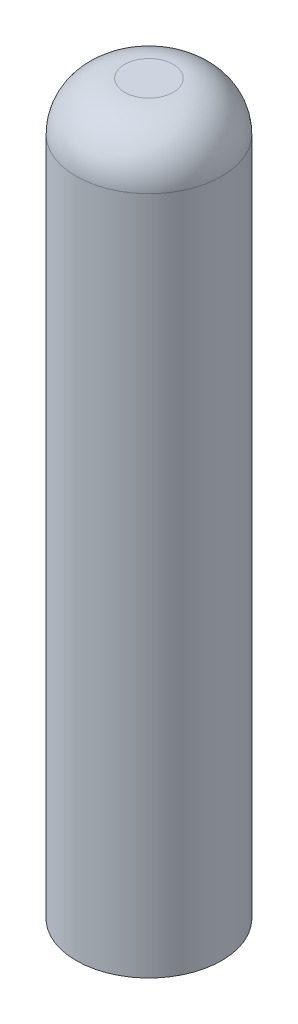
ISO-10303-21;
HEADER;
FILE_DESCRIPTION(('STEP AP214'),'2;1');
FILE_NAME('part.step','',(''),(''),'','','');
FILE_SCHEMA(('AUTOMOTIVE_DESIGN { 1 0 10303 214 1 1 1 1 }'));
ENDSEC;
DATA;
#1=APPLICATION_CONTEXT('core data for automotive mechanical design processes');
#2=APPLICATION_PROTOCOL_DEFINITION('international standard','automotive_design',2000,#1);
#3=PRODUCT_CONTEXT('',#1,'mechanical');
#4=PRODUCT('Part','Part','',(#3));
#5=PRODUCT_RELATED_PRODUCT_CATEGORY('part','',(#4));
#6=PRODUCT_DEFINITION_FORMATION('','',#4);
#7=PRODUCT_DEFINITION_CONTEXT('part definition',#1,'design');
#8=PRODUCT_DEFINITION('design','',#6,#7);
#9=PRODUCT_DEFINITION_SHAPE('','',#8);
#10=(LENGTH_UNIT() NAMED_UNIT(*) SI_UNIT(.MILLI.,.METRE.));
#11=(NAMED_UNIT(*) PLANE_ANGLE_UNIT() SI_UNIT($,.RADIAN.));
#12=(NAMED_UNIT(*) SI_UNIT($,.STERADIAN.) SOLID_ANGLE_UNIT());
#13=UNCERTAINTY_MEASURE_WITH_UNIT(LENGTH_MEASURE(1.E-05),#10,'distance_accuracy_value','');
#14=(GEOMETRIC_REPRESENTATION_CONTEXT(3) GLOBAL_UNCERTAINTY_ASSIGNED_CONTEXT((#13)) GLOBAL_UNIT_ASSIGNED_CONTEXT((#10,
#11,#12)) REPRESENTATION_CONTEXT('',''));
#15=CARTESIAN_POINT('',(0.,0.,0.));
#16=DIRECTION('',(0.,0.,1.));
#17=DIRECTION('',(1.,0.,0.));
#18=AXIS2_PLACEMENT_3D('',#15,#16,#17);
#19=CARTESIAN_POINT('',(0.,15.,0.));
#20=DIRECTION('',(0.,-1.,0.));
#21=DIRECTION('',(0.,0.,-1.));
#22=AXIS2_PLACEMENT_3D('',#19,#20,#21);
#23=CYLINDRICAL_SURFACE('',#22,1.5);
#24=CARTESIAN_POINT('',(0.,14.,0.));
#25=DIRECTION('',(0.,1.,0.));
#26=DIRECTION('',(0.,0.,1.));
#27=AXIS2_PLACEMENT_3D('',#24,#25,#26);
#28=CIRCLE('',#27,1.5);
#29=CARTESIAN_POINT('',(0.,14.,1.5));
#30=VERTEX_POINT('',#29);
#31=EDGE_CURVE('E10',#30,#30,#28,.F.);
#32=ORIENTED_EDGE('',*,*,#31,.T.);
#33=EDGE_LOOP('',(#32));
#34=FACE_BOUND('',#33,.T.);
#35=CARTESIAN_POINT('',(0.,0.,0.));
#36=DIRECTION('',(0.,1.,0.));
#37=DIRECTION('',(0.,0.,1.));
#38=AXIS2_PLACEMENT_3D('',#35,#36,#37);
#39=CIRCLE('',#38,1.5);
#40=CARTESIAN_POINT('',(0.,0.,1.5));
#41=VERTEX_POINT('',#40);
#42=EDGE_CURVE('E49',#41,#41,#39,.T.);
#43=ORIENTED_EDGE('',*,*,#42,.T.);
#44=EDGE_LOOP('',(#43));
#45=FACE_BOUND('',#44,.T.);
#46=ADVANCED_FACE('F38',(#34,#45),#23,.T.);
#47=CARTESIAN_POINT('',(0.,15.,0.));
#48=DIRECTION('',(0.,1.,0.));
#49=DIRECTION('',(0.,0.,1.));
#50=AXIS2_PLACEMENT_3D('',#47,#48,#49);
#51=PLANE('',#50);
#52=CARTESIAN_POINT('',(0.,15.,0.));
#53=DIRECTION('',(0.,1.,0.));
#54=DIRECTION('',(0.,0.,1.));
#55=AXIS2_PLACEMENT_3D('',#52,#53,#54);
#56=CIRCLE('',#55,0.5);
#57=CARTESIAN_POINT('',(0.,15.,0.5));
#58=VERTEX_POINT('',#57);
#59=EDGE_CURVE('E45',#58,#58,#56,.T.);
#60=ORIENTED_EDGE('',*,*,#59,.T.);
#61=EDGE_LOOP('',(#60));
#62=FACE_BOUND('',#61,.T.);
#63=ADVANCED_FACE('F59',(#62),#51,.T.);
#64=CARTESIAN_POINT('',(0.,0.,0.));
#65=DIRECTION('',(0.,1.,0.));
#66=DIRECTION('',(0.,0.,1.));
#67=AXIS2_PLACEMENT_3D('',#64,#65,#66);
#68=PLANE('',#67);
#69=ORIENTED_EDGE('',*,*,#42,.F.);
#70=EDGE_LOOP('',(#69));
#71=FACE_BOUND('',#70,.T.);
#72=ADVANCED_FACE('F57',(#71),#68,.F.);
#73=CARTESIAN_POINT('',(0.,14.,0.));
#74=DIRECTION('',(0.,1.,0.));
#75=DIRECTION('',(0.,0.,1.));
#76=AXIS2_PLACEMENT_3D('',#73,#74,#75);
#77=DEGENERATE_TOROIDAL_SURFACE('',#76,0.5,1.,.T.);
#78=ORIENTED_EDGE('',*,*,#31,.F.);
#79=EDGE_LOOP('',(#78));
#80=FACE_BOUND('',#79,.T.);
#81=ORIENTED_EDGE('',*,*,#59,.F.);
#82=EDGE_LOOP('',(#81));
#83=FACE_BOUND('',#82,.T.);
#84=ADVANCED_FACE('F40',(#80,#83),#77,.T.);
#85=CLOSED_SHELL('',(#46,#63,#72,#84));
#86=MANIFOLD_SOLID_BREP('B2',#85);
#87=ADVANCED_BREP_SHAPE_REPRESENTATION('',(#18,#86),#14);
#88=SHAPE_DEFINITION_REPRESENTATION(#9,#87);
ENDSEC;
END-ISO-10303-21;
